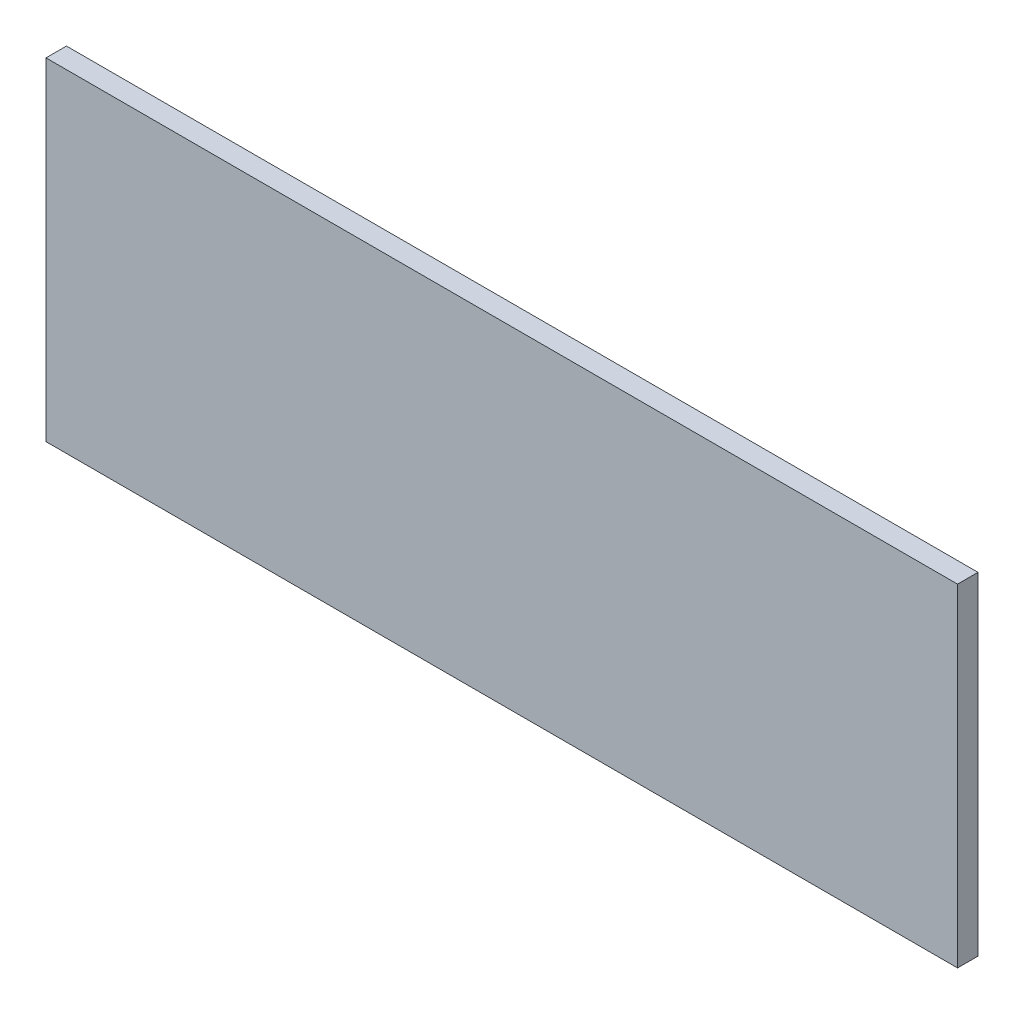
ISO-10303-21;
HEADER;
FILE_DESCRIPTION(('STEP AP214'),'2;1');
FILE_NAME('part.step','',(''),(''),'','','');
FILE_SCHEMA(('AUTOMOTIVE_DESIGN { 1 0 10303 214 1 1 1 1 }'));
ENDSEC;
DATA;
#1=APPLICATION_CONTEXT('core data for automotive mechanical design processes');
#2=APPLICATION_PROTOCOL_DEFINITION('international standard','automotive_design',2000,#1);
#3=PRODUCT_CONTEXT('',#1,'mechanical');
#4=PRODUCT('Part','Part','',(#3));
#5=PRODUCT_RELATED_PRODUCT_CATEGORY('part','',(#4));
#6=PRODUCT_DEFINITION_FORMATION('','',#4);
#7=PRODUCT_DEFINITION_CONTEXT('part definition',#1,'design');
#8=PRODUCT_DEFINITION('design','',#6,#7);
#9=PRODUCT_DEFINITION_SHAPE('','',#8);
#10=(LENGTH_UNIT() NAMED_UNIT(*) SI_UNIT(.MILLI.,.METRE.));
#11=(NAMED_UNIT(*) PLANE_ANGLE_UNIT() SI_UNIT($,.RADIAN.));
#12=(NAMED_UNIT(*) SI_UNIT($,.STERADIAN.) SOLID_ANGLE_UNIT());
#13=UNCERTAINTY_MEASURE_WITH_UNIT(LENGTH_MEASURE(1.E-05),#10,'distance_accuracy_value','');
#14=(GEOMETRIC_REPRESENTATION_CONTEXT(3) GLOBAL_UNCERTAINTY_ASSIGNED_CONTEXT((#13)) GLOBAL_UNIT_ASSIGNED_CONTEXT((#10,
#11,#12)) REPRESENTATION_CONTEXT('',''));
#15=CARTESIAN_POINT('',(0.,0.,0.));
#16=DIRECTION('',(0.,0.,1.));
#17=DIRECTION('',(1.,0.,0.));
#18=AXIS2_PLACEMENT_3D('',#15,#16,#17);
#19=CARTESIAN_POINT('',(-356.5,-130.,16.));
#20=DIRECTION('',(1.,0.,0.));
#21=DIRECTION('',(0.,0.,-1.));
#22=AXIS2_PLACEMENT_3D('',#19,#20,#21);
#23=PLANE('',#22);
#24=DIRECTION('',(0.,-1.,0.));
#25=VECTOR('',#24,1.);
#26=CARTESIAN_POINT('',(-356.5,-130.,0.));
#27=LINE('',#26,#25);
#28=CARTESIAN_POINT('',(-356.5,130.,0.));
#29=VERTEX_POINT('',#28);
#30=CARTESIAN_POINT('',(-356.5,-130.,0.));
#31=VERTEX_POINT('',#30);
#32=EDGE_CURVE('E98',#29,#31,#27,.T.);
#33=ORIENTED_EDGE('',*,*,#32,.T.);
#34=DIRECTION('',(0.,0.,-1.));
#35=VECTOR('',#34,1.);
#36=CARTESIAN_POINT('',(-356.5,-130.,16.));
#37=LINE('',#36,#35);
#38=CARTESIAN_POINT('',(-356.5,-130.,16.));
#39=VERTEX_POINT('',#38);
#40=EDGE_CURVE('E11',#39,#31,#37,.T.);
#41=ORIENTED_EDGE('',*,*,#40,.F.);
#42=DIRECTION('',(0.,-1.,0.));
#43=VECTOR('',#42,1.);
#44=CARTESIAN_POINT('',(-356.5,-130.,16.));
#45=LINE('',#44,#43);
#46=CARTESIAN_POINT('',(-356.5,130.,16.));
#47=VERTEX_POINT('',#46);
#48=EDGE_CURVE('E86',#47,#39,#45,.T.);
#49=ORIENTED_EDGE('',*,*,#48,.F.);
#50=DIRECTION('',(0.,0.,-1.));
#51=VECTOR('',#50,1.);
#52=CARTESIAN_POINT('',(-356.5,130.,16.));
#53=LINE('',#52,#51);
#54=EDGE_CURVE('E94',#47,#29,#53,.T.);
#55=ORIENTED_EDGE('',*,*,#54,.T.);
#56=EDGE_LOOP('',(#33,#41,#49,#55));
#57=FACE_BOUND('',#56,.T.);
#58=ADVANCED_FACE('F35',(#57),#23,.F.);
#59=CARTESIAN_POINT('',(356.5,-130.,16.));
#60=DIRECTION('',(0.,1.,0.));
#61=DIRECTION('',(-1.,0.,0.));
#62=AXIS2_PLACEMENT_3D('',#59,#60,#61);
#63=PLANE('',#62);
#64=DIRECTION('',(1.,0.,0.));
#65=VECTOR('',#64,1.);
#66=CARTESIAN_POINT('',(356.5,-130.,0.));
#67=LINE('',#66,#65);
#68=CARTESIAN_POINT('',(356.5,-130.,0.));
#69=VERTEX_POINT('',#68);
#70=EDGE_CURVE('E90',#31,#69,#67,.T.);
#71=ORIENTED_EDGE('',*,*,#70,.T.);
#72=DIRECTION('',(0.,0.,-1.));
#73=VECTOR('',#72,1.);
#74=CARTESIAN_POINT('',(356.5,-130.,16.));
#75=LINE('',#74,#73);
#76=CARTESIAN_POINT('',(356.5,-130.,16.));
#77=VERTEX_POINT('',#76);
#78=EDGE_CURVE('E43',#77,#69,#75,.T.);
#79=ORIENTED_EDGE('',*,*,#78,.F.);
#80=DIRECTION('',(1.,0.,0.));
#81=VECTOR('',#80,1.);
#82=CARTESIAN_POINT('',(356.5,-130.,16.));
#83=LINE('',#82,#81);
#84=EDGE_CURVE('E81',#39,#77,#83,.T.);
#85=ORIENTED_EDGE('',*,*,#84,.F.);
#86=ORIENTED_EDGE('',*,*,#40,.T.);
#87=EDGE_LOOP('',(#71,#79,#85,#86));
#88=FACE_BOUND('',#87,.T.);
#89=ADVANCED_FACE('F89',(#88),#63,.F.);
#90=CARTESIAN_POINT('',(356.5,-130.,16.));
#91=DIRECTION('',(-1.,0.,0.));
#92=DIRECTION('',(0.,0.,1.));
#93=AXIS2_PLACEMENT_3D('',#90,#91,#92);
#94=PLANE('',#93);
#95=DIRECTION('',(0.,1.,0.));
#96=VECTOR('',#95,1.);
#97=CARTESIAN_POINT('',(356.5,-130.,0.));
#98=LINE('',#97,#96);
#99=CARTESIAN_POINT('',(356.5,130.,0.));
#100=VERTEX_POINT('',#99);
#101=EDGE_CURVE('E68',#69,#100,#98,.T.);
#102=ORIENTED_EDGE('',*,*,#101,.T.);
#103=DIRECTION('',(0.,0.,-1.));
#104=VECTOR('',#103,1.);
#105=CARTESIAN_POINT('',(356.5,130.,16.));
#106=LINE('',#105,#104);
#107=CARTESIAN_POINT('',(356.5,130.,16.));
#108=VERTEX_POINT('',#107);
#109=EDGE_CURVE('E91',#108,#100,#106,.T.);
#110=ORIENTED_EDGE('',*,*,#109,.F.);
#111=DIRECTION('',(0.,1.,0.));
#112=VECTOR('',#111,1.);
#113=CARTESIAN_POINT('',(356.5,-130.,16.));
#114=LINE('',#113,#112);
#115=EDGE_CURVE('E84',#77,#108,#114,.T.);
#116=ORIENTED_EDGE('',*,*,#115,.F.);
#117=ORIENTED_EDGE('',*,*,#78,.T.);
#118=EDGE_LOOP('',(#102,#110,#116,#117));
#119=FACE_BOUND('',#118,.T.);
#120=ADVANCED_FACE('F92',(#119),#94,.F.);
#121=CARTESIAN_POINT('',(356.5,130.,16.));
#122=DIRECTION('',(0.,-1.,0.));
#123=DIRECTION('',(1.,0.,0.));
#124=AXIS2_PLACEMENT_3D('',#121,#122,#123);
#125=PLANE('',#124);
#126=DIRECTION('',(-1.,0.,0.));
#127=VECTOR('',#126,1.);
#128=CARTESIAN_POINT('',(356.5,130.,0.));
#129=LINE('',#128,#127);
#130=EDGE_CURVE('E74',#100,#29,#129,.T.);
#131=ORIENTED_EDGE('',*,*,#130,.T.);
#132=ORIENTED_EDGE('',*,*,#54,.F.);
#133=DIRECTION('',(-1.,0.,0.));
#134=VECTOR('',#133,1.);
#135=CARTESIAN_POINT('',(356.5,130.,16.));
#136=LINE('',#135,#134);
#137=EDGE_CURVE('E51',#108,#47,#136,.T.);
#138=ORIENTED_EDGE('',*,*,#137,.F.);
#139=ORIENTED_EDGE('',*,*,#109,.T.);
#140=EDGE_LOOP('',(#131,#132,#138,#139));
#141=FACE_BOUND('',#140,.T.);
#142=ADVANCED_FACE('F105',(#141),#125,.F.);
#143=CARTESIAN_POINT('',(0.,0.,16.));
#144=DIRECTION('',(0.,0.,1.));
#145=DIRECTION('',(1.,0.,0.));
#146=AXIS2_PLACEMENT_3D('',#143,#144,#145);
#147=PLANE('',#146);
#148=ORIENTED_EDGE('',*,*,#48,.T.);
#149=ORIENTED_EDGE('',*,*,#84,.T.);
#150=ORIENTED_EDGE('',*,*,#115,.T.);
#151=ORIENTED_EDGE('',*,*,#137,.T.);
#152=EDGE_LOOP('',(#148,#149,#150,#151));
#153=FACE_BOUND('',#152,.T.);
#154=ADVANCED_FACE('F82',(#153),#147,.T.);
#155=CARTESIAN_POINT('',(0.,0.,0.));
#156=DIRECTION('',(0.,0.,1.));
#157=DIRECTION('',(1.,0.,0.));
#158=AXIS2_PLACEMENT_3D('',#155,#156,#157);
#159=PLANE('',#158);
#160=ORIENTED_EDGE('',*,*,#32,.F.);
#161=ORIENTED_EDGE('',*,*,#130,.F.);
#162=ORIENTED_EDGE('',*,*,#101,.F.);
#163=ORIENTED_EDGE('',*,*,#70,.F.);
#164=EDGE_LOOP('',(#160,#161,#162,#163));
#165=FACE_BOUND('',#164,.T.);
#166=ADVANCED_FACE('F108',(#165),#159,.F.);
#167=CLOSED_SHELL('',(#58,#89,#120,#142,#154,#166));
#168=MANIFOLD_SOLID_BREP('B2',#167);
#169=ADVANCED_BREP_SHAPE_REPRESENTATION('',(#18,#168),#14);
#170=SHAPE_DEFINITION_REPRESENTATION(#9,#169);
ENDSEC;
END-ISO-10303-21;
